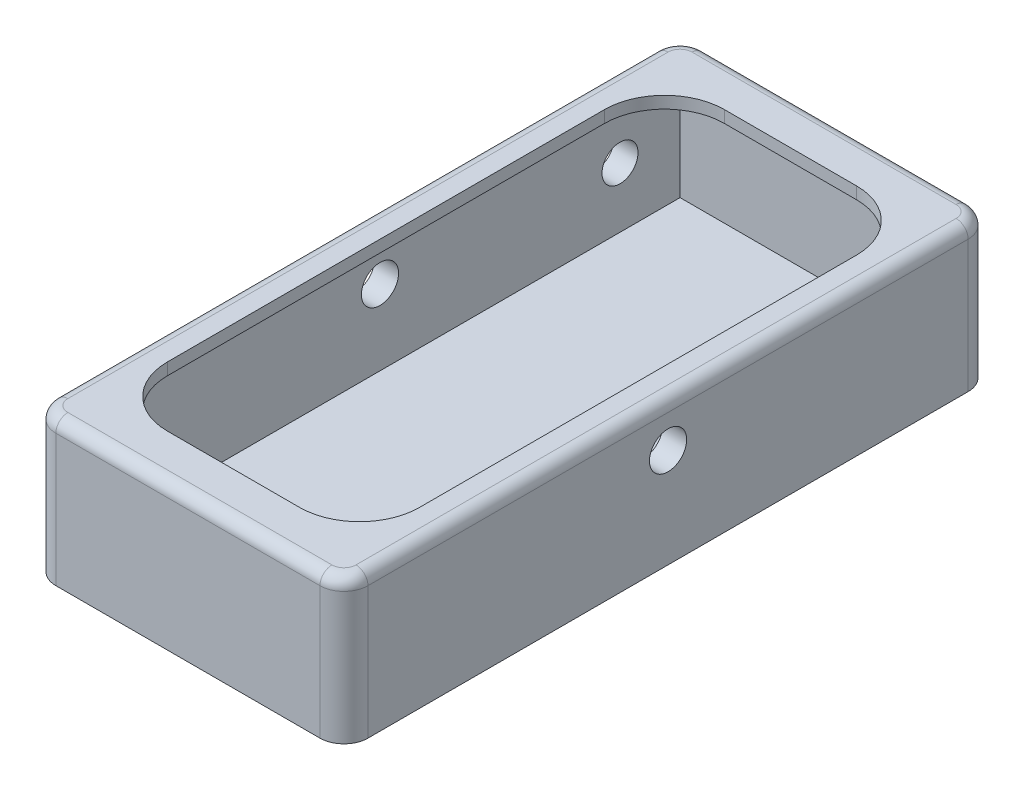
ISO-10303-21;
HEADER;
FILE_DESCRIPTION(('STEP AP214'),'2;1');
FILE_NAME('part.step','',(''),(''),'','','');
FILE_SCHEMA(('AUTOMOTIVE_DESIGN { 1 0 10303 214 1 1 1 1 }'));
ENDSEC;
DATA;
#1=APPLICATION_CONTEXT('core data for automotive mechanical design processes');
#2=APPLICATION_PROTOCOL_DEFINITION('international standard','automotive_design',2000,#1);
#3=PRODUCT_CONTEXT('',#1,'mechanical');
#4=PRODUCT('Part','Part','',(#3));
#5=PRODUCT_RELATED_PRODUCT_CATEGORY('part','',(#4));
#6=PRODUCT_DEFINITION_FORMATION('','',#4);
#7=PRODUCT_DEFINITION_CONTEXT('part definition',#1,'design');
#8=PRODUCT_DEFINITION('design','',#6,#7);
#9=PRODUCT_DEFINITION_SHAPE('','',#8);
#10=(LENGTH_UNIT() NAMED_UNIT(*) SI_UNIT(.MILLI.,.METRE.));
#11=(NAMED_UNIT(*) PLANE_ANGLE_UNIT() SI_UNIT($,.RADIAN.));
#12=(NAMED_UNIT(*) SI_UNIT($,.STERADIAN.) SOLID_ANGLE_UNIT());
#13=UNCERTAINTY_MEASURE_WITH_UNIT(LENGTH_MEASURE(1.E-05),#10,'distance_accuracy_value','');
#14=(GEOMETRIC_REPRESENTATION_CONTEXT(3) GLOBAL_UNCERTAINTY_ASSIGNED_CONTEXT((#13)) GLOBAL_UNIT_ASSIGNED_CONTEXT((#10,
#11,#12)) REPRESENTATION_CONTEXT('',''));
#15=CARTESIAN_POINT('',(0.,0.,0.));
#16=DIRECTION('',(0.,0.,1.));
#17=DIRECTION('',(1.,0.,0.));
#18=AXIS2_PLACEMENT_3D('',#15,#16,#17);
#19=CARTESIAN_POINT('',(0.,10.,0.));
#20=DIRECTION('',(1.,0.,0.));
#21=DIRECTION('',(0.,0.,-1.));
#22=AXIS2_PLACEMENT_3D('',#19,#20,#21);
#23=PLANE('',#22);
#24=CARTESIAN_POINT('',(0.,7.,-45.));
#25=DIRECTION('',(1.,0.,0.));
#26=DIRECTION('',(0.,0.,-1.));
#27=AXIS2_PLACEMENT_3D('',#24,#25,#26);
#28=CIRCLE('',#27,1.5);
#29=CARTESIAN_POINT('',(0.,7.,-46.5));
#30=VERTEX_POINT('',#29);
#31=EDGE_CURVE('E391',#30,#30,#28,.F.);
#32=ORIENTED_EDGE('',*,*,#31,.T.);
#33=EDGE_LOOP('',(#32));
#34=FACE_BOUND('',#33,.T.);
#35=CARTESIAN_POINT('',(0.,8.27,-25.));
#36=DIRECTION('',(1.,0.,0.));
#37=DIRECTION('',(0.,0.,-1.));
#38=AXIS2_PLACEMENT_3D('',#35,#36,#37);
#39=CIRCLE('',#38,1.55);
#40=CARTESIAN_POINT('',(0.,8.27,-26.55));
#41=VERTEX_POINT('',#40);
#42=EDGE_CURVE('E239',#41,#41,#39,.T.);
#43=ORIENTED_EDGE('',*,*,#42,.F.);
#44=EDGE_LOOP('',(#43));
#45=FACE_BOUND('',#44,.T.);
#46=DIRECTION('',(0.,-1.,0.));
#47=VECTOR('',#46,1.);
#48=CARTESIAN_POINT('',(0.,10.,-50.));
#49=LINE('',#48,#47);
#50=CARTESIAN_POINT('',(0.,11.,-50.));
#51=VERTEX_POINT('',#50);
#52=CARTESIAN_POINT('',(0.,2.,-50.));
#53=VERTEX_POINT('',#52);
#54=EDGE_CURVE('E210',#51,#53,#49,.T.);
#55=ORIENTED_EDGE('',*,*,#54,.F.);
#56=DIRECTION('',(0.,0.,1.));
#57=VECTOR('',#56,1.);
#58=CARTESIAN_POINT('',(0.,11.,-50.));
#59=LINE('',#58,#57);
#60=CARTESIAN_POINT('',(0.,11.,0.));
#61=VERTEX_POINT('',#60);
#62=EDGE_CURVE('E197',#51,#61,#59,.T.);
#63=ORIENTED_EDGE('',*,*,#62,.T.);
#64=DIRECTION('',(0.,-1.,0.));
#65=VECTOR('',#64,1.);
#66=CARTESIAN_POINT('',(0.,10.,0.));
#67=LINE('',#66,#65);
#68=CARTESIAN_POINT('',(0.,2.,0.));
#69=VERTEX_POINT('',#68);
#70=EDGE_CURVE('E208',#61,#69,#67,.T.);
#71=ORIENTED_EDGE('',*,*,#70,.T.);
#72=DIRECTION('',(0.,0.,1.));
#73=VECTOR('',#72,1.);
#74=CARTESIAN_POINT('',(0.,2.,0.));
#75=LINE('',#74,#73);
#76=EDGE_CURVE('E404',#53,#69,#75,.T.);
#77=ORIENTED_EDGE('',*,*,#76,.F.);
#78=EDGE_LOOP('',(#55,#63,#71,#77));
#79=FACE_BOUND('',#78,.T.);
#80=ADVANCED_FACE('F34',(#34,#45,#79),#23,.T.);
#81=CARTESIAN_POINT('',(0.,10.,0.));
#82=DIRECTION('',(0.,0.,-1.));
#83=DIRECTION('',(-1.,0.,0.));
#84=AXIS2_PLACEMENT_3D('',#81,#82,#83);
#85=PLANE('',#84);
#86=ORIENTED_EDGE('',*,*,#70,.F.);
#87=DIRECTION('',(1.,0.,0.));
#88=VECTOR('',#87,1.);
#89=CARTESIAN_POINT('',(0.,11.,0.));
#90=LINE('',#89,#88);
#91=CARTESIAN_POINT('',(22.,11.,0.));
#92=VERTEX_POINT('',#91);
#93=EDGE_CURVE('E194',#61,#92,#90,.T.);
#94=ORIENTED_EDGE('',*,*,#93,.T.);
#95=DIRECTION('',(0.,-1.,0.));
#96=VECTOR('',#95,1.);
#97=CARTESIAN_POINT('',(22.,10.,0.));
#98=LINE('',#97,#96);
#99=CARTESIAN_POINT('',(22.,2.,0.));
#100=VERTEX_POINT('',#99);
#101=EDGE_CURVE('E218',#92,#100,#98,.T.);
#102=ORIENTED_EDGE('',*,*,#101,.T.);
#103=DIRECTION('',(1.,0.,0.));
#104=VECTOR('',#103,1.);
#105=CARTESIAN_POINT('',(0.,2.,0.));
#106=LINE('',#105,#104);
#107=EDGE_CURVE('E215',#69,#100,#106,.T.);
#108=ORIENTED_EDGE('',*,*,#107,.F.);
#109=EDGE_LOOP('',(#86,#94,#102,#108));
#110=FACE_BOUND('',#109,.T.);
#111=ADVANCED_FACE('F213',(#110),#85,.T.);
#112=CARTESIAN_POINT('',(22.,10.,0.));
#113=DIRECTION('',(-1.,0.,0.));
#114=DIRECTION('',(0.,0.,1.));
#115=AXIS2_PLACEMENT_3D('',#112,#113,#114);
#116=PLANE('',#115);
#117=CARTESIAN_POINT('',(22.,8.27,-25.));
#118=DIRECTION('',(-1.,0.,0.));
#119=DIRECTION('',(0.,0.,1.));
#120=AXIS2_PLACEMENT_3D('',#117,#118,#119);
#121=CIRCLE('',#120,1.55);
#122=CARTESIAN_POINT('',(22.,8.27,-23.45));
#123=VERTEX_POINT('',#122);
#124=EDGE_CURVE('E236',#123,#123,#121,.T.);
#125=ORIENTED_EDGE('',*,*,#124,.F.);
#126=EDGE_LOOP('',(#125));
#127=FACE_BOUND('',#126,.T.);
#128=ORIENTED_EDGE('',*,*,#101,.F.);
#129=DIRECTION('',(0.,0.,-1.));
#130=VECTOR('',#129,1.);
#131=CARTESIAN_POINT('',(22.,11.,0.));
#132=LINE('',#131,#130);
#133=CARTESIAN_POINT('',(22.,11.,-50.));
#134=VERTEX_POINT('',#133);
#135=EDGE_CURVE('E200',#92,#134,#132,.T.);
#136=ORIENTED_EDGE('',*,*,#135,.T.);
#137=DIRECTION('',(0.,-1.,0.));
#138=VECTOR('',#137,1.);
#139=CARTESIAN_POINT('',(22.,10.,-50.));
#140=LINE('',#139,#138);
#141=CARTESIAN_POINT('',(22.,2.,-50.));
#142=VERTEX_POINT('',#141);
#143=EDGE_CURVE('E223',#134,#142,#140,.T.);
#144=ORIENTED_EDGE('',*,*,#143,.T.);
#145=DIRECTION('',(0.,0.,-1.));
#146=VECTOR('',#145,1.);
#147=CARTESIAN_POINT('',(22.,2.,0.));
#148=LINE('',#147,#146);
#149=EDGE_CURVE('E407',#100,#142,#148,.T.);
#150=ORIENTED_EDGE('',*,*,#149,.F.);
#151=EDGE_LOOP('',(#128,#136,#144,#150));
#152=FACE_BOUND('',#151,.T.);
#153=ADVANCED_FACE('F416',(#127,#152),#116,.T.);
#154=CARTESIAN_POINT('',(0.,10.,-50.));
#155=DIRECTION('',(0.,0.,1.));
#156=DIRECTION('',(1.,0.,0.));
#157=AXIS2_PLACEMENT_3D('',#154,#155,#156);
#158=PLANE('',#157);
#159=ORIENTED_EDGE('',*,*,#143,.F.);
#160=DIRECTION('',(-1.,0.,0.));
#161=VECTOR('',#160,1.);
#162=CARTESIAN_POINT('',(22.,11.,-50.));
#163=LINE('',#162,#161);
#164=EDGE_CURVE('E389',#134,#51,#163,.T.);
#165=ORIENTED_EDGE('',*,*,#164,.T.);
#166=ORIENTED_EDGE('',*,*,#54,.T.);
#167=DIRECTION('',(-1.,0.,0.));
#168=VECTOR('',#167,1.);
#169=CARTESIAN_POINT('',(0.,2.,-50.));
#170=LINE('',#169,#168);
#171=EDGE_CURVE('E410',#142,#53,#170,.T.);
#172=ORIENTED_EDGE('',*,*,#171,.F.);
#173=EDGE_LOOP('',(#159,#165,#166,#172));
#174=FACE_BOUND('',#173,.T.);
#175=ADVANCED_FACE('F421',(#174),#158,.T.);
#176=CARTESIAN_POINT('',(0.,12.,0.));
#177=DIRECTION('',(0.,1.,0.));
#178=DIRECTION('',(0.,0.,1.));
#179=AXIS2_PLACEMENT_3D('',#176,#177,#178);
#180=PLANE('',#179);
#181=DIRECTION('',(-1.,0.,0.));
#182=VECTOR('',#181,1.);
#183=CARTESIAN_POINT('',(0.,12.,-51.));
#184=LINE('',#183,#182);
#185=CARTESIAN_POINT('',(22.,12.,-51.));
#186=VERTEX_POINT('',#185);
#187=CARTESIAN_POINT('',(0.,12.,-51.));
#188=VERTEX_POINT('',#187);
#189=EDGE_CURVE('E280',#186,#188,#184,.T.);
#190=ORIENTED_EDGE('',*,*,#189,.T.);
#191=CARTESIAN_POINT('',(0.,12.,-50.));
#192=DIRECTION('',(0.,1.,0.));
#193=DIRECTION('',(0.,0.,1.));
#194=AXIS2_PLACEMENT_3D('',#191,#192,#193);
#195=CIRCLE('',#194,1.);
#196=CARTESIAN_POINT('',(-1.00000000000001,12.,-50.));
#197=VERTEX_POINT('',#196);
#198=EDGE_CURVE('E282',#188,#197,#195,.T.);
#199=ORIENTED_EDGE('',*,*,#198,.T.);
#200=DIRECTION('',(0.,0.,1.));
#201=VECTOR('',#200,1.);
#202=CARTESIAN_POINT('',(-1.,12.,0.));
#203=LINE('',#202,#201);
#204=CARTESIAN_POINT('',(-1.,12.,0.));
#205=VERTEX_POINT('',#204);
#206=EDGE_CURVE('E268',#197,#205,#203,.T.);
#207=ORIENTED_EDGE('',*,*,#206,.T.);
#208=CARTESIAN_POINT('',(0.,12.,0.));
#209=DIRECTION('',(0.,1.,0.));
#210=DIRECTION('',(0.,0.,1.));
#211=AXIS2_PLACEMENT_3D('',#208,#209,#210);
#212=CIRCLE('',#211,1.);
#213=CARTESIAN_POINT('',(0.,12.,1.));
#214=VERTEX_POINT('',#213);
#215=EDGE_CURVE('E270',#205,#214,#212,.T.);
#216=ORIENTED_EDGE('',*,*,#215,.T.);
#217=DIRECTION('',(1.,0.,0.));
#218=VECTOR('',#217,1.);
#219=CARTESIAN_POINT('',(22.,12.,1.));
#220=LINE('',#219,#218);
#221=CARTESIAN_POINT('',(22.,12.,1.));
#222=VERTEX_POINT('',#221);
#223=EDGE_CURVE('E272',#214,#222,#220,.T.);
#224=ORIENTED_EDGE('',*,*,#223,.T.);
#225=CARTESIAN_POINT('',(22.,12.,0.));
#226=DIRECTION('',(0.,1.,0.));
#227=DIRECTION('',(0.,0.,1.));
#228=AXIS2_PLACEMENT_3D('',#225,#226,#227);
#229=CIRCLE('',#228,1.);
#230=CARTESIAN_POINT('',(23.,12.,0.));
#231=VERTEX_POINT('',#230);
#232=EDGE_CURVE('E274',#222,#231,#229,.T.);
#233=ORIENTED_EDGE('',*,*,#232,.T.);
#234=DIRECTION('',(0.,0.,-1.));
#235=VECTOR('',#234,1.);
#236=CARTESIAN_POINT('',(23.,12.,-50.));
#237=LINE('',#236,#235);
#238=CARTESIAN_POINT('',(23.,12.,-50.));
#239=VERTEX_POINT('',#238);
#240=EDGE_CURVE('E276',#231,#239,#237,.T.);
#241=ORIENTED_EDGE('',*,*,#240,.T.);
#242=CARTESIAN_POINT('',(22.,12.,-50.));
#243=DIRECTION('',(0.,1.,0.));
#244=DIRECTION('',(0.,0.,1.));
#245=AXIS2_PLACEMENT_3D('',#242,#243,#244);
#246=CIRCLE('',#245,1.);
#247=EDGE_CURVE('E278',#239,#186,#246,.T.);
#248=ORIENTED_EDGE('',*,*,#247,.T.);
#249=EDGE_LOOP('',(#190,#199,#207,#216,#224,#233,#241,#248));
#250=FACE_BOUND('',#249,.T.);
#251=DIRECTION('',(0.,0.,1.));
#252=VECTOR('',#251,1.);
#253=CARTESIAN_POINT('',(0.5,12.,-48.2));
#254=LINE('',#253,#252);
#255=CARTESIAN_POINT('',(0.500000000000001,12.,-43.2));
#256=VERTEX_POINT('',#255);
#257=CARTESIAN_POINT('',(0.500000000000005,12.,-6.8));
#258=VERTEX_POINT('',#257);
#259=EDGE_CURVE('E325',#256,#258,#254,.T.);
#260=ORIENTED_EDGE('',*,*,#259,.F.);
#261=CARTESIAN_POINT('',(5.5,12.,-43.2));
#262=DIRECTION('',(0.,1.,0.));
#263=DIRECTION('',(0.,0.,1.));
#264=AXIS2_PLACEMENT_3D('',#261,#262,#263);
#265=CIRCLE('',#264,5.);
#266=CARTESIAN_POINT('',(5.5,12.,-48.2));
#267=VERTEX_POINT('',#266);
#268=EDGE_CURVE('E42',#256,#267,#265,.F.);
#269=ORIENTED_EDGE('',*,*,#268,.T.);
#270=DIRECTION('',(-1.,0.,0.));
#271=VECTOR('',#270,1.);
#272=CARTESIAN_POINT('',(0.5,12.,-48.2));
#273=LINE('',#272,#271);
#274=CARTESIAN_POINT('',(16.5,12.,-48.2));
#275=VERTEX_POINT('',#274);
#276=EDGE_CURVE('E360',#275,#267,#273,.T.);
#277=ORIENTED_EDGE('',*,*,#276,.F.);
#278=CARTESIAN_POINT('',(16.5,12.,-43.2));
#279=DIRECTION('',(0.,1.,0.));
#280=DIRECTION('',(0.,0.,1.));
#281=AXIS2_PLACEMENT_3D('',#278,#279,#280);
#282=CIRCLE('',#281,5.);
#283=CARTESIAN_POINT('',(21.5,12.,-43.2));
#284=VERTEX_POINT('',#283);
#285=EDGE_CURVE('E344',#275,#284,#282,.F.);
#286=ORIENTED_EDGE('',*,*,#285,.T.);
#287=DIRECTION('',(0.,0.,-1.));
#288=VECTOR('',#287,1.);
#289=CARTESIAN_POINT('',(21.5,12.,-48.2));
#290=LINE('',#289,#288);
#291=CARTESIAN_POINT('',(21.5,12.,-6.8));
#292=VERTEX_POINT('',#291);
#293=EDGE_CURVE('E369',#292,#284,#290,.T.);
#294=ORIENTED_EDGE('',*,*,#293,.F.);
#295=CARTESIAN_POINT('',(16.5,12.,-6.8));
#296=DIRECTION('',(0.,1.,0.));
#297=DIRECTION('',(0.,0.,1.));
#298=AXIS2_PLACEMENT_3D('',#295,#296,#297);
#299=CIRCLE('',#298,5.);
#300=CARTESIAN_POINT('',(16.5,12.,-1.8));
#301=VERTEX_POINT('',#300);
#302=EDGE_CURVE('E348',#292,#301,#299,.F.);
#303=ORIENTED_EDGE('',*,*,#302,.T.);
#304=DIRECTION('',(1.,0.,0.));
#305=VECTOR('',#304,1.);
#306=CARTESIAN_POINT('',(0.500000000000006,12.,-1.8));
#307=LINE('',#306,#305);
#308=CARTESIAN_POINT('',(5.50000000000001,12.,-1.8));
#309=VERTEX_POINT('',#308);
#310=EDGE_CURVE('E383',#309,#301,#307,.T.);
#311=ORIENTED_EDGE('',*,*,#310,.F.);
#312=CARTESIAN_POINT('',(5.50000000000001,12.,-6.8));
#313=DIRECTION('',(0.,1.,0.));
#314=DIRECTION('',(0.,0.,1.));
#315=AXIS2_PLACEMENT_3D('',#312,#313,#314);
#316=CIRCLE('',#315,5.);
#317=EDGE_CURVE('E352',#309,#258,#316,.F.);
#318=ORIENTED_EDGE('',*,*,#317,.T.);
#319=EDGE_LOOP('',(#260,#269,#277,#286,#294,#303,#311,#318));
#320=FACE_BOUND('',#319,.T.);
#321=ADVANCED_FACE('F359',(#250,#320),#180,.T.);
#322=CARTESIAN_POINT('',(-2.,12.,0.));
#323=DIRECTION('',(1.,0.,0.));
#324=DIRECTION('',(0.,0.,-1.));
#325=AXIS2_PLACEMENT_3D('',#322,#323,#324);
#326=PLANE('',#325);
#327=CARTESIAN_POINT('',(-2.00000000000001,7.,-45.));
#328=DIRECTION('',(-1.,0.,0.));
#329=DIRECTION('',(0.,0.,1.));
#330=AXIS2_PLACEMENT_3D('',#327,#328,#329);
#331=CIRCLE('',#330,1.5);
#332=CARTESIAN_POINT('',(-2.00000000000001,7.,-43.5));
#333=VERTEX_POINT('',#332);
#334=EDGE_CURVE('E394',#333,#333,#331,.T.);
#335=ORIENTED_EDGE('',*,*,#334,.F.);
#336=EDGE_LOOP('',(#335));
#337=FACE_BOUND('',#336,.T.);
#338=CARTESIAN_POINT('',(-2.,8.27,-25.));
#339=DIRECTION('',(-1.,0.,0.));
#340=DIRECTION('',(0.,0.,1.));
#341=AXIS2_PLACEMENT_3D('',#338,#339,#340);
#342=CIRCLE('',#341,1.55);
#343=CARTESIAN_POINT('',(-2.,8.27,-23.45));
#344=VERTEX_POINT('',#343);
#345=EDGE_CURVE('E397',#344,#344,#342,.T.);
#346=ORIENTED_EDGE('',*,*,#345,.F.);
#347=EDGE_LOOP('',(#346));
#348=FACE_BOUND('',#347,.T.);
#349=DIRECTION('',(0.,-1.,0.));
#350=VECTOR('',#349,1.);
#351=CARTESIAN_POINT('',(-2.,12.,0.));
#352=LINE('',#351,#350);
#353=CARTESIAN_POINT('',(-2.,0.,0.));
#354=VERTEX_POINT('',#353);
#355=CARTESIAN_POINT('',(-2.,11.,0.));
#356=VERTEX_POINT('',#355);
#357=EDGE_CURVE('E265',#354,#356,#352,.F.);
#358=ORIENTED_EDGE('',*,*,#357,.T.);
#359=DIRECTION('',(0.,0.,1.));
#360=VECTOR('',#359,1.);
#361=CARTESIAN_POINT('',(-2.00000000000001,11.,-50.));
#362=LINE('',#361,#360);
#363=CARTESIAN_POINT('',(-2.00000000000001,11.,-50.));
#364=VERTEX_POINT('',#363);
#365=EDGE_CURVE('E300',#356,#364,#362,.F.);
#366=ORIENTED_EDGE('',*,*,#365,.T.);
#367=DIRECTION('',(0.,-1.,0.));
#368=VECTOR('',#367,1.);
#369=CARTESIAN_POINT('',(-2.00000000000001,12.,-50.));
#370=LINE('',#369,#368);
#371=CARTESIAN_POINT('',(-2.00000000000001,0.,-50.));
#372=VERTEX_POINT('',#371);
#373=EDGE_CURVE('E263',#364,#372,#370,.T.);
#374=ORIENTED_EDGE('',*,*,#373,.T.);
#375=DIRECTION('',(0.,0.,1.));
#376=VECTOR('',#375,1.);
#377=CARTESIAN_POINT('',(-2.,0.,0.));
#378=LINE('',#377,#376);
#379=EDGE_CURVE('E217',#372,#354,#378,.T.);
#380=ORIENTED_EDGE('',*,*,#379,.T.);
#381=EDGE_LOOP('',(#358,#366,#374,#380));
#382=FACE_BOUND('',#381,.T.);
#383=ADVANCED_FACE('F428',(#337,#348,#382),#326,.F.);
#384=CARTESIAN_POINT('',(0.,12.,2.));
#385=DIRECTION('',(0.,0.,-1.));
#386=DIRECTION('',(-1.,0.,0.));
#387=AXIS2_PLACEMENT_3D('',#384,#385,#386);
#388=PLANE('',#387);
#389=DIRECTION('',(0.,-1.,0.));
#390=VECTOR('',#389,1.);
#391=CARTESIAN_POINT('',(22.,12.,2.));
#392=LINE('',#391,#390);
#393=CARTESIAN_POINT('',(22.,0.,2.));
#394=VERTEX_POINT('',#393);
#395=CARTESIAN_POINT('',(22.,11.,2.));
#396=VERTEX_POINT('',#395);
#397=EDGE_CURVE('E260',#394,#396,#392,.F.);
#398=ORIENTED_EDGE('',*,*,#397,.T.);
#399=DIRECTION('',(1.,0.,0.));
#400=VECTOR('',#399,1.);
#401=CARTESIAN_POINT('',(0.,11.,2.));
#402=LINE('',#401,#400);
#403=CARTESIAN_POINT('',(0.,11.,2.));
#404=VERTEX_POINT('',#403);
#405=EDGE_CURVE('E296',#396,#404,#402,.F.);
#406=ORIENTED_EDGE('',*,*,#405,.T.);
#407=DIRECTION('',(0.,-1.,0.));
#408=VECTOR('',#407,1.);
#409=CARTESIAN_POINT('',(0.,12.,2.));
#410=LINE('',#409,#408);
#411=CARTESIAN_POINT('',(0.,0.,2.));
#412=VERTEX_POINT('',#411);
#413=EDGE_CURVE('E258',#404,#412,#410,.T.);
#414=ORIENTED_EDGE('',*,*,#413,.T.);
#415=DIRECTION('',(1.,0.,0.));
#416=VECTOR('',#415,1.);
#417=CARTESIAN_POINT('',(0.,0.,2.));
#418=LINE('',#417,#416);
#419=EDGE_CURVE('E221',#412,#394,#418,.T.);
#420=ORIENTED_EDGE('',*,*,#419,.T.);
#421=EDGE_LOOP('',(#398,#406,#414,#420));
#422=FACE_BOUND('',#421,.T.);
#423=ADVANCED_FACE('F454',(#422),#388,.F.);
#424=CARTESIAN_POINT('',(24.,12.,0.));
#425=DIRECTION('',(-1.,0.,0.));
#426=DIRECTION('',(0.,0.,1.));
#427=AXIS2_PLACEMENT_3D('',#424,#425,#426);
#428=PLANE('',#427);
#429=CARTESIAN_POINT('',(24.,8.27,-25.));
#430=DIRECTION('',(-1.,0.,0.));
#431=DIRECTION('',(0.,0.,1.));
#432=AXIS2_PLACEMENT_3D('',#429,#430,#431);
#433=CIRCLE('',#432,1.55);
#434=CARTESIAN_POINT('',(24.,8.27,-23.45));
#435=VERTEX_POINT('',#434);
#436=EDGE_CURVE('E240',#435,#435,#433,.T.);
#437=ORIENTED_EDGE('',*,*,#436,.T.);
#438=EDGE_LOOP('',(#437));
#439=FACE_BOUND('',#438,.T.);
#440=DIRECTION('',(0.,-1.,0.));
#441=VECTOR('',#440,1.);
#442=CARTESIAN_POINT('',(24.,12.,-50.));
#443=LINE('',#442,#441);
#444=CARTESIAN_POINT('',(24.,0.,-50.));
#445=VERTEX_POINT('',#444);
#446=CARTESIAN_POINT('',(24.,11.,-50.));
#447=VERTEX_POINT('',#446);
#448=EDGE_CURVE('E255',#445,#447,#443,.F.);
#449=ORIENTED_EDGE('',*,*,#448,.T.);
#450=DIRECTION('',(0.,0.,-1.));
#451=VECTOR('',#450,1.);
#452=CARTESIAN_POINT('',(24.,11.,0.));
#453=LINE('',#452,#451);
#454=CARTESIAN_POINT('',(24.,11.,0.));
#455=VERTEX_POINT('',#454);
#456=EDGE_CURVE('E292',#447,#455,#453,.F.);
#457=ORIENTED_EDGE('',*,*,#456,.T.);
#458=DIRECTION('',(0.,-1.,0.));
#459=VECTOR('',#458,1.);
#460=CARTESIAN_POINT('',(24.,12.,0.));
#461=LINE('',#460,#459);
#462=CARTESIAN_POINT('',(24.,0.,0.));
#463=VERTEX_POINT('',#462);
#464=EDGE_CURVE('E253',#455,#463,#461,.T.);
#465=ORIENTED_EDGE('',*,*,#464,.T.);
#466=DIRECTION('',(0.,0.,-1.));
#467=VECTOR('',#466,1.);
#468=CARTESIAN_POINT('',(24.,0.,0.));
#469=LINE('',#468,#467);
#470=EDGE_CURVE('E229',#463,#445,#469,.T.);
#471=ORIENTED_EDGE('',*,*,#470,.T.);
#472=EDGE_LOOP('',(#449,#457,#465,#471));
#473=FACE_BOUND('',#472,.T.);
#474=ADVANCED_FACE('F450',(#439,#473),#428,.F.);
#475=CARTESIAN_POINT('',(0.,12.,-52.));
#476=DIRECTION('',(0.,0.,1.));
#477=DIRECTION('',(1.,0.,0.));
#478=AXIS2_PLACEMENT_3D('',#475,#476,#477);
#479=PLANE('',#478);
#480=DIRECTION('',(0.,-1.,0.));
#481=VECTOR('',#480,1.);
#482=CARTESIAN_POINT('',(0.,12.,-52.));
#483=LINE('',#482,#481);
#484=CARTESIAN_POINT('',(0.,0.,-52.));
#485=VERTEX_POINT('',#484);
#486=CARTESIAN_POINT('',(0.,11.,-52.));
#487=VERTEX_POINT('',#486);
#488=EDGE_CURVE('E235',#485,#487,#483,.F.);
#489=ORIENTED_EDGE('',*,*,#488,.T.);
#490=DIRECTION('',(-1.,0.,0.));
#491=VECTOR('',#490,1.);
#492=CARTESIAN_POINT('',(22.,11.,-52.));
#493=LINE('',#492,#491);
#494=CARTESIAN_POINT('',(22.,11.,-52.));
#495=VERTEX_POINT('',#494);
#496=EDGE_CURVE('E288',#487,#495,#493,.F.);
#497=ORIENTED_EDGE('',*,*,#496,.T.);
#498=DIRECTION('',(0.,-1.,0.));
#499=VECTOR('',#498,1.);
#500=CARTESIAN_POINT('',(22.,12.,-52.));
#501=LINE('',#500,#499);
#502=CARTESIAN_POINT('',(22.,0.,-52.));
#503=VERTEX_POINT('',#502);
#504=EDGE_CURVE('E243',#495,#503,#501,.T.);
#505=ORIENTED_EDGE('',*,*,#504,.T.);
#506=DIRECTION('',(-1.,0.,0.));
#507=VECTOR('',#506,1.);
#508=CARTESIAN_POINT('',(0.,0.,-52.));
#509=LINE('',#508,#507);
#510=EDGE_CURVE('E232',#503,#485,#509,.T.);
#511=ORIENTED_EDGE('',*,*,#510,.T.);
#512=EDGE_LOOP('',(#489,#497,#505,#511));
#513=FACE_BOUND('',#512,.T.);
#514=ADVANCED_FACE('F446',(#513),#479,.F.);
#515=CARTESIAN_POINT('',(0.,0.,0.));
#516=DIRECTION('',(0.,1.,0.));
#517=DIRECTION('',(0.,0.,1.));
#518=AXIS2_PLACEMENT_3D('',#515,#516,#517);
#519=PLANE('',#518);
#520=ORIENTED_EDGE('',*,*,#510,.F.);
#521=CARTESIAN_POINT('',(22.,0.,-50.));
#522=DIRECTION('',(0.,1.,0.));
#523=DIRECTION('',(0.,0.,1.));
#524=AXIS2_PLACEMENT_3D('',#521,#522,#523);
#525=CIRCLE('',#524,2.);
#526=EDGE_CURVE('E251',#503,#445,#525,.F.);
#527=ORIENTED_EDGE('',*,*,#526,.T.);
#528=ORIENTED_EDGE('',*,*,#470,.F.);
#529=CARTESIAN_POINT('',(22.,0.,0.));
#530=DIRECTION('',(0.,1.,0.));
#531=DIRECTION('',(0.,0.,1.));
#532=AXIS2_PLACEMENT_3D('',#529,#530,#531);
#533=CIRCLE('',#532,2.);
#534=EDGE_CURVE('E249',#463,#394,#533,.F.);
#535=ORIENTED_EDGE('',*,*,#534,.T.);
#536=ORIENTED_EDGE('',*,*,#419,.F.);
#537=CARTESIAN_POINT('',(0.,0.,0.));
#538=DIRECTION('',(0.,1.,0.));
#539=DIRECTION('',(0.,0.,1.));
#540=AXIS2_PLACEMENT_3D('',#537,#538,#539);
#541=CIRCLE('',#540,2.);
#542=EDGE_CURVE('E247',#412,#354,#541,.F.);
#543=ORIENTED_EDGE('',*,*,#542,.T.);
#544=ORIENTED_EDGE('',*,*,#379,.F.);
#545=CARTESIAN_POINT('',(0.,0.,-50.));
#546=DIRECTION('',(0.,1.,0.));
#547=DIRECTION('',(0.,0.,1.));
#548=AXIS2_PLACEMENT_3D('',#545,#546,#547);
#549=CIRCLE('',#548,2.);
#550=EDGE_CURVE('E245',#372,#485,#549,.F.);
#551=ORIENTED_EDGE('',*,*,#550,.T.);
#552=EDGE_LOOP('',(#520,#527,#528,#535,#536,#543,#544,#551));
#553=FACE_BOUND('',#552,.T.);
#554=ADVANCED_FACE('F443',(#553),#519,.F.);
#555=CARTESIAN_POINT('',(0.,2.,0.));
#556=DIRECTION('',(0.,1.,0.));
#557=DIRECTION('',(0.,0.,1.));
#558=AXIS2_PLACEMENT_3D('',#555,#556,#557);
#559=PLANE('',#558);
#560=ORIENTED_EDGE('',*,*,#76,.T.);
#561=ORIENTED_EDGE('',*,*,#107,.T.);
#562=ORIENTED_EDGE('',*,*,#149,.T.);
#563=ORIENTED_EDGE('',*,*,#171,.T.);
#564=EDGE_LOOP('',(#560,#561,#562,#563));
#565=FACE_BOUND('',#564,.T.);
#566=ADVANCED_FACE('F420',(#565),#559,.T.);
#567=CARTESIAN_POINT('',(24.,8.27,-25.));
#568=DIRECTION('',(-1.,0.,0.));
#569=DIRECTION('',(0.,0.,1.));
#570=AXIS2_PLACEMENT_3D('',#567,#568,#569);
#571=CYLINDRICAL_SURFACE('',#570,1.55);
#572=ORIENTED_EDGE('',*,*,#124,.T.);
#573=EDGE_LOOP('',(#572));
#574=FACE_BOUND('',#573,.T.);
#575=ORIENTED_EDGE('',*,*,#436,.F.);
#576=EDGE_LOOP('',(#575));
#577=FACE_BOUND('',#576,.T.);
#578=ADVANCED_FACE('F555',(#574,#577),#571,.F.);
#579=ORIENTED_EDGE('',*,*,#42,.T.);
#580=EDGE_LOOP('',(#579));
#581=FACE_BOUND('',#580,.T.);
#582=ORIENTED_EDGE('',*,*,#345,.T.);
#583=EDGE_LOOP('',(#582));
#584=FACE_BOUND('',#583,.T.);
#585=ADVANCED_FACE('F553',(#581,#584),#571,.F.);
#586=CARTESIAN_POINT('',(24.001,7.,-45.));
#587=DIRECTION('',(-1.,0.,0.));
#588=DIRECTION('',(0.,0.,1.));
#589=AXIS2_PLACEMENT_3D('',#586,#587,#588);
#590=CYLINDRICAL_SURFACE('',#589,1.5);
#591=ORIENTED_EDGE('',*,*,#31,.F.);
#592=EDGE_LOOP('',(#591));
#593=FACE_BOUND('',#592,.T.);
#594=ORIENTED_EDGE('',*,*,#334,.T.);
#595=EDGE_LOOP('',(#594));
#596=FACE_BOUND('',#595,.T.);
#597=ADVANCED_FACE('F550',(#593,#596),#590,.F.);
#598=CARTESIAN_POINT('',(0.,11.,0.));
#599=DIRECTION('',(0.,1.,0.));
#600=DIRECTION('',(0.,0.,1.));
#601=AXIS2_PLACEMENT_3D('',#598,#599,#600);
#602=PLANE('',#601);
#603=DIRECTION('',(0.,0.,-1.));
#604=VECTOR('',#603,1.);
#605=CARTESIAN_POINT('',(21.5,11.,-48.2));
#606=LINE('',#605,#604);
#607=CARTESIAN_POINT('',(21.5,11.,-6.8));
#608=VERTEX_POINT('',#607);
#609=CARTESIAN_POINT('',(21.5,11.,-43.2));
#610=VERTEX_POINT('',#609);
#611=EDGE_CURVE('E376',#608,#610,#606,.T.);
#612=ORIENTED_EDGE('',*,*,#611,.T.);
#613=CARTESIAN_POINT('',(16.5,11.,-43.2));
#614=DIRECTION('',(0.,1.,0.));
#615=DIRECTION('',(0.,0.,1.));
#616=AXIS2_PLACEMENT_3D('',#613,#614,#615);
#617=CIRCLE('',#616,5.);
#618=CARTESIAN_POINT('',(16.5,11.,-48.2));
#619=VERTEX_POINT('',#618);
#620=EDGE_CURVE('E346',#610,#619,#617,.T.);
#621=ORIENTED_EDGE('',*,*,#620,.T.);
#622=DIRECTION('',(-1.,0.,0.));
#623=VECTOR('',#622,1.);
#624=CARTESIAN_POINT('',(0.5,11.,-48.2));
#625=LINE('',#624,#623);
#626=CARTESIAN_POINT('',(5.5,11.,-48.2));
#627=VERTEX_POINT('',#626);
#628=EDGE_CURVE('E211',#619,#627,#625,.T.);
#629=ORIENTED_EDGE('',*,*,#628,.T.);
#630=CARTESIAN_POINT('',(5.5,11.,-43.2));
#631=DIRECTION('',(0.,1.,0.));
#632=DIRECTION('',(0.,0.,1.));
#633=AXIS2_PLACEMENT_3D('',#630,#631,#632);
#634=CIRCLE('',#633,5.);
#635=CARTESIAN_POINT('',(0.500000000000001,11.,-43.2));
#636=VERTEX_POINT('',#635);
#637=EDGE_CURVE('E11',#627,#636,#634,.T.);
#638=ORIENTED_EDGE('',*,*,#637,.T.);
#639=DIRECTION('',(0.,0.,1.));
#640=VECTOR('',#639,1.);
#641=CARTESIAN_POINT('',(0.5,11.,-48.2));
#642=LINE('',#641,#640);
#643=CARTESIAN_POINT('',(0.500000000000005,11.,-6.8));
#644=VERTEX_POINT('',#643);
#645=EDGE_CURVE('E368',#636,#644,#642,.T.);
#646=ORIENTED_EDGE('',*,*,#645,.T.);
#647=CARTESIAN_POINT('',(5.50000000000001,11.,-6.8));
#648=DIRECTION('',(0.,1.,0.));
#649=DIRECTION('',(0.,0.,1.));
#650=AXIS2_PLACEMENT_3D('',#647,#648,#649);
#651=CIRCLE('',#650,5.);
#652=CARTESIAN_POINT('',(5.50000000000001,11.,-1.8));
#653=VERTEX_POINT('',#652);
#654=EDGE_CURVE('E354',#644,#653,#651,.T.);
#655=ORIENTED_EDGE('',*,*,#654,.T.);
#656=DIRECTION('',(1.,0.,0.));
#657=VECTOR('',#656,1.);
#658=CARTESIAN_POINT('',(0.500000000000006,11.,-1.8));
#659=LINE('',#658,#657);
#660=CARTESIAN_POINT('',(16.5,11.,-1.8));
#661=VERTEX_POINT('',#660);
#662=EDGE_CURVE('E373',#653,#661,#659,.T.);
#663=ORIENTED_EDGE('',*,*,#662,.T.);
#664=CARTESIAN_POINT('',(16.5,11.,-6.8));
#665=DIRECTION('',(0.,1.,0.));
#666=DIRECTION('',(0.,0.,1.));
#667=AXIS2_PLACEMENT_3D('',#664,#665,#666);
#668=CIRCLE('',#667,5.);
#669=EDGE_CURVE('E350',#661,#608,#668,.T.);
#670=ORIENTED_EDGE('',*,*,#669,.T.);
#671=EDGE_LOOP('',(#612,#621,#629,#638,#646,#655,#663,#670));
#672=FACE_BOUND('',#671,.T.);
#673=ORIENTED_EDGE('',*,*,#62,.F.);
#674=ORIENTED_EDGE('',*,*,#164,.F.);
#675=ORIENTED_EDGE('',*,*,#135,.F.);
#676=ORIENTED_EDGE('',*,*,#93,.F.);
#677=EDGE_LOOP('',(#673,#674,#675,#676));
#678=FACE_BOUND('',#677,.T.);
#679=ADVANCED_FACE('F196',(#672,#678),#602,.F.);
#680=CARTESIAN_POINT('',(0.5,11.,-48.2));
#681=DIRECTION('',(-1.,0.,0.));
#682=DIRECTION('',(0.,0.,1.));
#683=AXIS2_PLACEMENT_3D('',#680,#681,#682);
#684=PLANE('',#683);
#685=ORIENTED_EDGE('',*,*,#259,.T.);
#686=DIRECTION('',(0.,1.,0.));
#687=VECTOR('',#686,1.);
#688=CARTESIAN_POINT('',(0.500000000000005,11.,-6.8));
#689=LINE('',#688,#687);
#690=EDGE_CURVE('E49',#258,#644,#689,.F.);
#691=ORIENTED_EDGE('',*,*,#690,.T.);
#692=ORIENTED_EDGE('',*,*,#645,.F.);
#693=DIRECTION('',(0.,1.,0.));
#694=VECTOR('',#693,1.);
#695=CARTESIAN_POINT('',(0.500000000000001,12.,-43.2));
#696=LINE('',#695,#694);
#697=EDGE_CURVE('E340',#636,#256,#696,.T.);
#698=ORIENTED_EDGE('',*,*,#697,.T.);
#699=EDGE_LOOP('',(#685,#691,#692,#698));
#700=FACE_BOUND('',#699,.T.);
#701=ADVANCED_FACE('F371',(#700),#684,.F.);
#702=CARTESIAN_POINT('',(0.5,11.,-48.2));
#703=DIRECTION('',(0.,0.,-1.));
#704=DIRECTION('',(-1.,0.,0.));
#705=AXIS2_PLACEMENT_3D('',#702,#703,#704);
#706=PLANE('',#705);
#707=ORIENTED_EDGE('',*,*,#628,.F.);
#708=DIRECTION('',(0.,1.,0.));
#709=VECTOR('',#708,1.);
#710=CARTESIAN_POINT('',(16.5,12.,-48.2));
#711=LINE('',#710,#709);
#712=EDGE_CURVE('E327',#619,#275,#711,.T.);
#713=ORIENTED_EDGE('',*,*,#712,.T.);
#714=ORIENTED_EDGE('',*,*,#276,.T.);
#715=DIRECTION('',(0.,1.,0.));
#716=VECTOR('',#715,1.);
#717=CARTESIAN_POINT('',(5.5,11.,-48.2));
#718=LINE('',#717,#716);
#719=EDGE_CURVE('E302',#267,#627,#718,.F.);
#720=ORIENTED_EDGE('',*,*,#719,.T.);
#721=EDGE_LOOP('',(#707,#713,#714,#720));
#722=FACE_BOUND('',#721,.T.);
#723=ADVANCED_FACE('F366',(#722),#706,.F.);
#724=CARTESIAN_POINT('',(21.5,11.,-48.2));
#725=DIRECTION('',(1.,0.,0.));
#726=DIRECTION('',(0.,0.,-1.));
#727=AXIS2_PLACEMENT_3D('',#724,#725,#726);
#728=PLANE('',#727);
#729=ORIENTED_EDGE('',*,*,#293,.T.);
#730=DIRECTION('',(0.,1.,0.));
#731=VECTOR('',#730,1.);
#732=CARTESIAN_POINT('',(21.5,11.,-43.2));
#733=LINE('',#732,#731);
#734=EDGE_CURVE('E333',#284,#610,#733,.F.);
#735=ORIENTED_EDGE('',*,*,#734,.T.);
#736=ORIENTED_EDGE('',*,*,#611,.F.);
#737=DIRECTION('',(0.,1.,0.));
#738=VECTOR('',#737,1.);
#739=CARTESIAN_POINT('',(21.5,12.,-6.8));
#740=LINE('',#739,#738);
#741=EDGE_CURVE('E330',#608,#292,#740,.T.);
#742=ORIENTED_EDGE('',*,*,#741,.T.);
#743=EDGE_LOOP('',(#729,#735,#736,#742));
#744=FACE_BOUND('',#743,.T.);
#745=ADVANCED_FACE('F534',(#744),#728,.F.);
#746=CARTESIAN_POINT('',(0.500000000000006,11.,-1.8));
#747=DIRECTION('',(0.,0.,1.));
#748=DIRECTION('',(1.,0.,0.));
#749=AXIS2_PLACEMENT_3D('',#746,#747,#748);
#750=PLANE('',#749);
#751=ORIENTED_EDGE('',*,*,#310,.T.);
#752=DIRECTION('',(0.,1.,0.));
#753=VECTOR('',#752,1.);
#754=CARTESIAN_POINT('',(16.5,11.,-1.8));
#755=LINE('',#754,#753);
#756=EDGE_CURVE('E338',#301,#661,#755,.F.);
#757=ORIENTED_EDGE('',*,*,#756,.T.);
#758=ORIENTED_EDGE('',*,*,#662,.F.);
#759=DIRECTION('',(0.,1.,0.));
#760=VECTOR('',#759,1.);
#761=CARTESIAN_POINT('',(5.50000000000001,12.,-1.8));
#762=LINE('',#761,#760);
#763=EDGE_CURVE('E335',#653,#309,#762,.T.);
#764=ORIENTED_EDGE('',*,*,#763,.T.);
#765=EDGE_LOOP('',(#751,#757,#758,#764));
#766=FACE_BOUND('',#765,.T.);
#767=ADVANCED_FACE('F466',(#766),#750,.F.);
#768=CARTESIAN_POINT('',(22.,12.,-50.));
#769=DIRECTION('',(0.,-1.,0.));
#770=DIRECTION('',(0.,0.,-1.));
#771=AXIS2_PLACEMENT_3D('',#768,#769,#770);
#772=CYLINDRICAL_SURFACE('',#771,2.);
#773=ORIENTED_EDGE('',*,*,#504,.F.);
#774=CARTESIAN_POINT('',(22.,11.,-50.));
#775=DIRECTION('',(0.,1.,0.));
#776=DIRECTION('',(0.,0.,1.));
#777=AXIS2_PLACEMENT_3D('',#774,#775,#776);
#778=CIRCLE('',#777,2.);
#779=EDGE_CURVE('E290',#495,#447,#778,.F.);
#780=ORIENTED_EDGE('',*,*,#779,.T.);
#781=ORIENTED_EDGE('',*,*,#448,.F.);
#782=ORIENTED_EDGE('',*,*,#526,.F.);
#783=EDGE_LOOP('',(#773,#780,#781,#782));
#784=FACE_BOUND('',#783,.T.);
#785=ADVANCED_FACE('F462',(#784),#772,.T.);
#786=CARTESIAN_POINT('',(22.,12.,0.));
#787=DIRECTION('',(0.,-1.,0.));
#788=DIRECTION('',(0.,0.,-1.));
#789=AXIS2_PLACEMENT_3D('',#786,#787,#788);
#790=CYLINDRICAL_SURFACE('',#789,2.);
#791=ORIENTED_EDGE('',*,*,#464,.F.);
#792=CARTESIAN_POINT('',(22.,11.,0.));
#793=DIRECTION('',(0.,1.,0.));
#794=DIRECTION('',(0.,0.,1.));
#795=AXIS2_PLACEMENT_3D('',#792,#793,#794);
#796=CIRCLE('',#795,2.);
#797=EDGE_CURVE('E294',#455,#396,#796,.F.);
#798=ORIENTED_EDGE('',*,*,#797,.T.);
#799=ORIENTED_EDGE('',*,*,#397,.F.);
#800=ORIENTED_EDGE('',*,*,#534,.F.);
#801=EDGE_LOOP('',(#791,#798,#799,#800));
#802=FACE_BOUND('',#801,.T.);
#803=ADVANCED_FACE('F465',(#802),#790,.T.);
#804=CARTESIAN_POINT('',(0.,12.,0.));
#805=DIRECTION('',(0.,-1.,0.));
#806=DIRECTION('',(0.,0.,-1.));
#807=AXIS2_PLACEMENT_3D('',#804,#805,#806);
#808=CYLINDRICAL_SURFACE('',#807,2.);
#809=ORIENTED_EDGE('',*,*,#413,.F.);
#810=CARTESIAN_POINT('',(0.,11.,0.));
#811=DIRECTION('',(0.,1.,0.));
#812=DIRECTION('',(0.,0.,1.));
#813=AXIS2_PLACEMENT_3D('',#810,#811,#812);
#814=CIRCLE('',#813,2.);
#815=EDGE_CURVE('E298',#404,#356,#814,.F.);
#816=ORIENTED_EDGE('',*,*,#815,.T.);
#817=ORIENTED_EDGE('',*,*,#357,.F.);
#818=ORIENTED_EDGE('',*,*,#542,.F.);
#819=EDGE_LOOP('',(#809,#816,#817,#818));
#820=FACE_BOUND('',#819,.T.);
#821=ADVANCED_FACE('F470',(#820),#808,.T.);
#822=CARTESIAN_POINT('',(0.,12.,-50.));
#823=DIRECTION('',(0.,-1.,0.));
#824=DIRECTION('',(0.,0.,-1.));
#825=AXIS2_PLACEMENT_3D('',#822,#823,#824);
#826=CYLINDRICAL_SURFACE('',#825,2.);
#827=ORIENTED_EDGE('',*,*,#373,.F.);
#828=CARTESIAN_POINT('',(0.,11.,-50.));
#829=DIRECTION('',(0.,1.,0.));
#830=DIRECTION('',(0.,0.,1.));
#831=AXIS2_PLACEMENT_3D('',#828,#829,#830);
#832=CIRCLE('',#831,2.);
#833=EDGE_CURVE('E285',#364,#487,#832,.F.);
#834=ORIENTED_EDGE('',*,*,#833,.T.);
#835=ORIENTED_EDGE('',*,*,#488,.F.);
#836=ORIENTED_EDGE('',*,*,#550,.F.);
#837=EDGE_LOOP('',(#827,#834,#835,#836));
#838=FACE_BOUND('',#837,.T.);
#839=ADVANCED_FACE('F474',(#838),#826,.T.);
#840=CARTESIAN_POINT('',(22.,11.,0.));
#841=DIRECTION('',(0.,1.,0.));
#842=DIRECTION('',(0.,0.,1.));
#843=AXIS2_PLACEMENT_3D('',#840,#841,#842);
#844=DEGENERATE_TOROIDAL_SURFACE('',#843,1.,1.,.T.);
#845=CARTESIAN_POINT('',(22.,11.,1.));
#846=DIRECTION('',(-1.,0.,0.));
#847=DIRECTION('',(0.,0.,1.));
#848=AXIS2_PLACEMENT_3D('',#845,#846,#847);
#849=CIRCLE('',#848,1.);
#850=EDGE_CURVE('E319',#396,#222,#849,.T.);
#851=ORIENTED_EDGE('',*,*,#850,.F.);
#852=ORIENTED_EDGE('',*,*,#797,.F.);
#853=CARTESIAN_POINT('',(23.,11.,0.));
#854=DIRECTION('',(0.,0.,-1.));
#855=DIRECTION('',(-1.,0.,0.));
#856=AXIS2_PLACEMENT_3D('',#853,#854,#855);
#857=CIRCLE('',#856,1.);
#858=EDGE_CURVE('E322',#231,#455,#857,.T.);
#859=ORIENTED_EDGE('',*,*,#858,.F.);
#860=ORIENTED_EDGE('',*,*,#232,.F.);
#861=EDGE_LOOP('',(#851,#852,#859,#860));
#862=FACE_BOUND('',#861,.T.);
#863=ADVANCED_FACE('F478',(#862),#844,.T.);
#864=CARTESIAN_POINT('',(23.,11.,0.));
#865=DIRECTION('',(0.,0.,1.));
#866=DIRECTION('',(1.,0.,0.));
#867=AXIS2_PLACEMENT_3D('',#864,#865,#866);
#868=CYLINDRICAL_SURFACE('',#867,1.);
#869=ORIENTED_EDGE('',*,*,#858,.T.);
#870=ORIENTED_EDGE('',*,*,#456,.F.);
#871=CARTESIAN_POINT('',(23.,11.,-50.));
#872=DIRECTION('',(0.,0.,-1.));
#873=DIRECTION('',(-1.,0.,0.));
#874=AXIS2_PLACEMENT_3D('',#871,#872,#873);
#875=CIRCLE('',#874,1.);
#876=EDGE_CURVE('E316',#239,#447,#875,.T.);
#877=ORIENTED_EDGE('',*,*,#876,.F.);
#878=ORIENTED_EDGE('',*,*,#240,.F.);
#879=EDGE_LOOP('',(#869,#870,#877,#878));
#880=FACE_BOUND('',#879,.T.);
#881=ADVANCED_FACE('F504',(#880),#868,.T.);
#882=CARTESIAN_POINT('',(0.,11.,1.));
#883=DIRECTION('',(-1.,0.,0.));
#884=DIRECTION('',(0.,0.,1.));
#885=AXIS2_PLACEMENT_3D('',#882,#883,#884);
#886=CYLINDRICAL_SURFACE('',#885,1.);
#887=ORIENTED_EDGE('',*,*,#850,.T.);
#888=ORIENTED_EDGE('',*,*,#223,.F.);
#889=CARTESIAN_POINT('',(0.,11.,1.));
#890=DIRECTION('',(-1.,0.,0.));
#891=DIRECTION('',(0.,0.,1.));
#892=AXIS2_PLACEMENT_3D('',#889,#890,#891);
#893=CIRCLE('',#892,1.);
#894=EDGE_CURVE('E313',#404,#214,#893,.T.);
#895=ORIENTED_EDGE('',*,*,#894,.F.);
#896=ORIENTED_EDGE('',*,*,#405,.F.);
#897=EDGE_LOOP('',(#887,#888,#895,#896));
#898=FACE_BOUND('',#897,.T.);
#899=ADVANCED_FACE('F500',(#898),#886,.T.);
#900=CARTESIAN_POINT('',(22.,11.,-50.));
#901=DIRECTION('',(0.,1.,0.));
#902=DIRECTION('',(0.,0.,1.));
#903=AXIS2_PLACEMENT_3D('',#900,#901,#902);
#904=DEGENERATE_TOROIDAL_SURFACE('',#903,1.,1.,.T.);
#905=ORIENTED_EDGE('',*,*,#876,.T.);
#906=ORIENTED_EDGE('',*,*,#779,.F.);
#907=CARTESIAN_POINT('',(22.,11.,-51.));
#908=DIRECTION('',(-1.,0.,0.));
#909=DIRECTION('',(0.,0.,1.));
#910=AXIS2_PLACEMENT_3D('',#907,#908,#909);
#911=CIRCLE('',#910,1.);
#912=EDGE_CURVE('E310',#186,#495,#911,.T.);
#913=ORIENTED_EDGE('',*,*,#912,.F.);
#914=ORIENTED_EDGE('',*,*,#247,.F.);
#915=EDGE_LOOP('',(#905,#906,#913,#914));
#916=FACE_BOUND('',#915,.T.);
#917=ADVANCED_FACE('F496',(#916),#904,.T.);
#918=CARTESIAN_POINT('',(0.,11.,0.));
#919=DIRECTION('',(0.,1.,0.));
#920=DIRECTION('',(0.,0.,1.));
#921=AXIS2_PLACEMENT_3D('',#918,#919,#920);
#922=DEGENERATE_TOROIDAL_SURFACE('',#921,1.,1.,.T.);
#923=ORIENTED_EDGE('',*,*,#894,.T.);
#924=ORIENTED_EDGE('',*,*,#215,.F.);
#925=CARTESIAN_POINT('',(-1.,11.,0.));
#926=DIRECTION('',(0.,0.,-1.));
#927=DIRECTION('',(-1.,0.,0.));
#928=AXIS2_PLACEMENT_3D('',#925,#926,#927);
#929=CIRCLE('',#928,1.);
#930=EDGE_CURVE('E307',#356,#205,#929,.T.);
#931=ORIENTED_EDGE('',*,*,#930,.F.);
#932=ORIENTED_EDGE('',*,*,#815,.F.);
#933=EDGE_LOOP('',(#923,#924,#931,#932));
#934=FACE_BOUND('',#933,.T.);
#935=ADVANCED_FACE('F492',(#934),#922,.T.);
#936=CARTESIAN_POINT('',(0.,11.,-51.));
#937=DIRECTION('',(1.,0.,0.));
#938=DIRECTION('',(0.,0.,-1.));
#939=AXIS2_PLACEMENT_3D('',#936,#937,#938);
#940=CYLINDRICAL_SURFACE('',#939,1.);
#941=ORIENTED_EDGE('',*,*,#912,.T.);
#942=ORIENTED_EDGE('',*,*,#496,.F.);
#943=CARTESIAN_POINT('',(0.,11.,-51.));
#944=DIRECTION('',(-1.,0.,0.));
#945=DIRECTION('',(0.,0.,1.));
#946=AXIS2_PLACEMENT_3D('',#943,#944,#945);
#947=CIRCLE('',#946,1.);
#948=EDGE_CURVE('E305',#188,#487,#947,.T.);
#949=ORIENTED_EDGE('',*,*,#948,.F.);
#950=ORIENTED_EDGE('',*,*,#189,.F.);
#951=EDGE_LOOP('',(#941,#942,#949,#950));
#952=FACE_BOUND('',#951,.T.);
#953=ADVANCED_FACE('F488',(#952),#940,.T.);
#954=CARTESIAN_POINT('',(-1.,11.,0.));
#955=DIRECTION('',(0.,0.,-1.));
#956=DIRECTION('',(-1.,0.,0.));
#957=AXIS2_PLACEMENT_3D('',#954,#955,#956);
#958=CYLINDRICAL_SURFACE('',#957,1.);
#959=ORIENTED_EDGE('',*,*,#930,.T.);
#960=ORIENTED_EDGE('',*,*,#206,.F.);
#961=CARTESIAN_POINT('',(-1.00000000000001,11.,-50.));
#962=DIRECTION('',(0.,0.,-1.));
#963=DIRECTION('',(-1.,0.,0.));
#964=AXIS2_PLACEMENT_3D('',#961,#962,#963);
#965=CIRCLE('',#964,1.);
#966=EDGE_CURVE('E303',#364,#197,#965,.T.);
#967=ORIENTED_EDGE('',*,*,#966,.F.);
#968=ORIENTED_EDGE('',*,*,#365,.F.);
#969=EDGE_LOOP('',(#959,#960,#967,#968));
#970=FACE_BOUND('',#969,.T.);
#971=ADVANCED_FACE('F484',(#970),#958,.T.);
#972=CARTESIAN_POINT('',(0.,11.,-50.));
#973=DIRECTION('',(0.,1.,0.));
#974=DIRECTION('',(0.,0.,1.));
#975=AXIS2_PLACEMENT_3D('',#972,#973,#974);
#976=DEGENERATE_TOROIDAL_SURFACE('',#975,1.,1.,.T.);
#977=ORIENTED_EDGE('',*,*,#948,.T.);
#978=ORIENTED_EDGE('',*,*,#833,.F.);
#979=ORIENTED_EDGE('',*,*,#966,.T.);
#980=ORIENTED_EDGE('',*,*,#198,.F.);
#981=EDGE_LOOP('',(#977,#978,#979,#980));
#982=FACE_BOUND('',#981,.T.);
#983=ADVANCED_FACE('F480',(#982),#976,.T.);
#984=CARTESIAN_POINT('',(16.5,11.,-43.2));
#985=DIRECTION('',(0.,-1.,0.));
#986=DIRECTION('',(0.,0.,-1.));
#987=AXIS2_PLACEMENT_3D('',#984,#985,#986);
#988=CYLINDRICAL_SURFACE('',#987,5.);
#989=ORIENTED_EDGE('',*,*,#620,.F.);
#990=ORIENTED_EDGE('',*,*,#734,.F.);
#991=ORIENTED_EDGE('',*,*,#285,.F.);
#992=ORIENTED_EDGE('',*,*,#712,.F.);
#993=EDGE_LOOP('',(#989,#990,#991,#992));
#994=FACE_BOUND('',#993,.T.);
#995=ADVANCED_FACE('F483',(#994),#988,.F.);
#996=CARTESIAN_POINT('',(16.5,11.,-6.8));
#997=DIRECTION('',(0.,-1.,0.));
#998=DIRECTION('',(0.,0.,-1.));
#999=AXIS2_PLACEMENT_3D('',#996,#997,#998);
#1000=CYLINDRICAL_SURFACE('',#999,5.);
#1001=ORIENTED_EDGE('',*,*,#669,.F.);
#1002=ORIENTED_EDGE('',*,*,#756,.F.);
#1003=ORIENTED_EDGE('',*,*,#302,.F.);
#1004=ORIENTED_EDGE('',*,*,#741,.F.);
#1005=EDGE_LOOP('',(#1001,#1002,#1003,#1004));
#1006=FACE_BOUND('',#1005,.T.);
#1007=ADVANCED_FACE('F514',(#1006),#1000,.F.);
#1008=CARTESIAN_POINT('',(5.50000000000001,11.,-6.8));
#1009=DIRECTION('',(0.,-1.,0.));
#1010=DIRECTION('',(0.,0.,-1.));
#1011=AXIS2_PLACEMENT_3D('',#1008,#1009,#1010);
#1012=CYLINDRICAL_SURFACE('',#1011,5.);
#1013=ORIENTED_EDGE('',*,*,#654,.F.);
#1014=ORIENTED_EDGE('',*,*,#690,.F.);
#1015=ORIENTED_EDGE('',*,*,#317,.F.);
#1016=ORIENTED_EDGE('',*,*,#763,.F.);
#1017=EDGE_LOOP('',(#1013,#1014,#1015,#1016));
#1018=FACE_BOUND('',#1017,.T.);
#1019=ADVANCED_FACE('F517',(#1018),#1012,.F.);
#1020=CARTESIAN_POINT('',(5.5,11.,-43.2));
#1021=DIRECTION('',(0.,-1.,0.));
#1022=DIRECTION('',(0.,0.,-1.));
#1023=AXIS2_PLACEMENT_3D('',#1020,#1021,#1022);
#1024=CYLINDRICAL_SURFACE('',#1023,5.);
#1025=ORIENTED_EDGE('',*,*,#637,.F.);
#1026=ORIENTED_EDGE('',*,*,#719,.F.);
#1027=ORIENTED_EDGE('',*,*,#268,.F.);
#1028=ORIENTED_EDGE('',*,*,#697,.F.);
#1029=EDGE_LOOP('',(#1025,#1026,#1027,#1028));
#1030=FACE_BOUND('',#1029,.T.);
#1031=ADVANCED_FACE('F36',(#1030),#1024,.F.);
#1032=CLOSED_SHELL('',(#80,#111,#153,#175,#321,#383,#423,#474,#514,#554,#566,#578,#585,#597,
#679,#701,#723,#745,#767,#785,#803,#821,#839,#863,#881,#899,#917,#935,#953,#971,#983,#995,#1007,
#1019,#1031));
#1033=MANIFOLD_SOLID_BREP('B2',#1032);
#1034=ADVANCED_BREP_SHAPE_REPRESENTATION('',(#18,#1033),#14);
#1035=SHAPE_DEFINITION_REPRESENTATION(#9,#1034);
ENDSEC;
END-ISO-10303-21;
